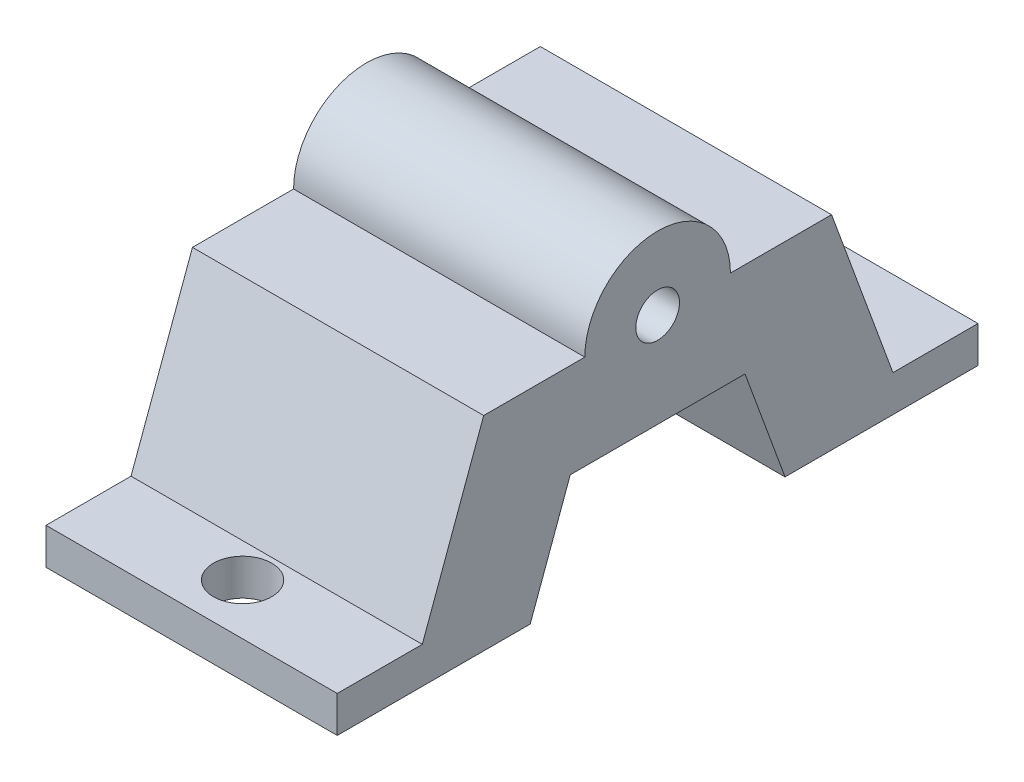
ISO-10303-21;
HEADER;
FILE_DESCRIPTION(('STEP AP214'),'2;1');
FILE_NAME('part.step','',(''),(''),'','','');
FILE_SCHEMA(('AUTOMOTIVE_DESIGN { 1 0 10303 214 1 1 1 1 }'));
ENDSEC;
DATA;
#1=APPLICATION_CONTEXT('core data for automotive mechanical design processes');
#2=APPLICATION_PROTOCOL_DEFINITION('international standard','automotive_design',2000,#1);
#3=PRODUCT_CONTEXT('',#1,'mechanical');
#4=PRODUCT('Part','Part','',(#3));
#5=PRODUCT_RELATED_PRODUCT_CATEGORY('part','',(#4));
#6=PRODUCT_DEFINITION_FORMATION('','',#4);
#7=PRODUCT_DEFINITION_CONTEXT('part definition',#1,'design');
#8=PRODUCT_DEFINITION('design','',#6,#7);
#9=PRODUCT_DEFINITION_SHAPE('','',#8);
#10=(LENGTH_UNIT() NAMED_UNIT(*) SI_UNIT(.MILLI.,.METRE.));
#11=(NAMED_UNIT(*) PLANE_ANGLE_UNIT() SI_UNIT($,.RADIAN.));
#12=(NAMED_UNIT(*) SI_UNIT($,.STERADIAN.) SOLID_ANGLE_UNIT());
#13=UNCERTAINTY_MEASURE_WITH_UNIT(LENGTH_MEASURE(1.E-05),#10,'distance_accuracy_value','');
#14=(GEOMETRIC_REPRESENTATION_CONTEXT(3) GLOBAL_UNCERTAINTY_ASSIGNED_CONTEXT((#13)) GLOBAL_UNIT_ASSIGNED_CONTEXT((#10,
#11,#12)) REPRESENTATION_CONTEXT('',''));
#15=CARTESIAN_POINT('',(0.,0.,0.));
#16=DIRECTION('',(0.,0.,1.));
#17=DIRECTION('',(1.,0.,0.));
#18=AXIS2_PLACEMENT_3D('',#15,#16,#17);
#19=CARTESIAN_POINT('',(-40.,0.,24.0972271209374));
#20=DIRECTION('',(0.,-1.,0.));
#21=DIRECTION('',(0.,0.,-1.));
#22=AXIS2_PLACEMENT_3D('',#19,#20,#21);
#23=PLANE('',#22);
#24=CARTESIAN_POINT('',(-20.,0.,17.0972271209374));
#25=DIRECTION('',(0.,-1.,0.));
#26=DIRECTION('',(0.,0.,-1.));
#27=AXIS2_PLACEMENT_3D('',#24,#25,#26);
#28=CIRCLE('',#27,4.);
#29=CARTESIAN_POINT('',(-20.,0.,13.0972271209374));
#30=VERTEX_POINT('',#29);
#31=EDGE_CURVE('E312',#30,#30,#28,.T.);
#32=ORIENTED_EDGE('',*,*,#31,.F.);
#33=EDGE_LOOP('',(#32));
#34=FACE_BOUND('',#33,.T.);
#35=DIRECTION('',(0.,0.,-1.));
#36=VECTOR('',#35,1.);
#37=CARTESIAN_POINT('',(0.,0.,24.0972271209374));
#38=LINE('',#37,#36);
#39=CARTESIAN_POINT('',(0.,0.,24.0972271209374));
#40=VERTEX_POINT('',#39);
#41=CARTESIAN_POINT('',(0.,0.,-2.40277287906259));
#42=VERTEX_POINT('',#41);
#43=EDGE_CURVE('E171',#40,#42,#38,.T.);
#44=ORIENTED_EDGE('',*,*,#43,.F.);
#45=DIRECTION('',(1.,0.,0.));
#46=VECTOR('',#45,1.);
#47=CARTESIAN_POINT('',(-40.,0.,24.0972271209374));
#48=LINE('',#47,#46);
#49=CARTESIAN_POINT('',(-40.,0.,24.0972271209374));
#50=VERTEX_POINT('',#49);
#51=EDGE_CURVE('E11',#50,#40,#48,.T.);
#52=ORIENTED_EDGE('',*,*,#51,.F.);
#53=DIRECTION('',(0.,0.,-1.));
#54=VECTOR('',#53,1.);
#55=CARTESIAN_POINT('',(-40.,0.,24.0972271209374));
#56=LINE('',#55,#54);
#57=CARTESIAN_POINT('',(-40.,0.,-2.40277287906259));
#58=VERTEX_POINT('',#57);
#59=EDGE_CURVE('E210',#50,#58,#56,.T.);
#60=ORIENTED_EDGE('',*,*,#59,.T.);
#61=DIRECTION('',(1.,0.,0.));
#62=VECTOR('',#61,1.);
#63=CARTESIAN_POINT('',(-40.,0.,-2.40277287906259));
#64=LINE('',#63,#62);
#65=EDGE_CURVE('E111',#58,#42,#64,.T.);
#66=ORIENTED_EDGE('',*,*,#65,.T.);
#67=EDGE_LOOP('',(#44,#52,#60,#66));
#68=FACE_BOUND('',#67,.T.);
#69=ADVANCED_FACE('F37',(#34,#68),#23,.T.);
#70=CARTESIAN_POINT('',(-40.,0.,24.0972271209374));
#71=DIRECTION('',(0.,0.,1.));
#72=DIRECTION('',(1.,0.,0.));
#73=AXIS2_PLACEMENT_3D('',#70,#71,#72);
#74=PLANE('',#73);
#75=DIRECTION('',(0.,-1.,0.));
#76=VECTOR('',#75,1.);
#77=CARTESIAN_POINT('',(0.,0.,24.0972271209374));
#78=LINE('',#77,#76);
#79=CARTESIAN_POINT('',(0.,5.,24.0972271209374));
#80=VERTEX_POINT('',#79);
#81=EDGE_CURVE('E208',#80,#40,#78,.T.);
#82=ORIENTED_EDGE('',*,*,#81,.F.);
#83=DIRECTION('',(1.,0.,0.));
#84=VECTOR('',#83,1.);
#85=CARTESIAN_POINT('',(-40.,5.,24.0972271209374));
#86=LINE('',#85,#84);
#87=CARTESIAN_POINT('',(-40.,5.,24.0972271209374));
#88=VERTEX_POINT('',#87);
#89=EDGE_CURVE('E46',#88,#80,#86,.T.);
#90=ORIENTED_EDGE('',*,*,#89,.F.);
#91=DIRECTION('',(0.,-1.,0.));
#92=VECTOR('',#91,1.);
#93=CARTESIAN_POINT('',(-40.,0.,24.0972271209374));
#94=LINE('',#93,#92);
#95=EDGE_CURVE('E161',#88,#50,#94,.T.);
#96=ORIENTED_EDGE('',*,*,#95,.T.);
#97=ORIENTED_EDGE('',*,*,#51,.T.);
#98=EDGE_LOOP('',(#82,#90,#96,#97));
#99=FACE_BOUND('',#98,.T.);
#100=ADVANCED_FACE('F235',(#99),#74,.T.);
#101=CARTESIAN_POINT('',(-40.,5.,24.0972271209374));
#102=DIRECTION('',(0.,1.,0.));
#103=DIRECTION('',(0.,0.,1.));
#104=AXIS2_PLACEMENT_3D('',#101,#102,#103);
#105=PLANE('',#104);
#106=CARTESIAN_POINT('',(-20.,5.,17.0972271209374));
#107=DIRECTION('',(0.,1.,0.));
#108=DIRECTION('',(0.,0.,1.));
#109=AXIS2_PLACEMENT_3D('',#106,#107,#108);
#110=CIRCLE('',#109,4.);
#111=CARTESIAN_POINT('',(-20.,5.,21.0972271209374));
#112=VERTEX_POINT('',#111);
#113=EDGE_CURVE('E315',#112,#112,#110,.T.);
#114=ORIENTED_EDGE('',*,*,#113,.F.);
#115=EDGE_LOOP('',(#114));
#116=FACE_BOUND('',#115,.T.);
#117=DIRECTION('',(0.,0.,1.));
#118=VECTOR('',#117,1.);
#119=CARTESIAN_POINT('',(0.,5.,24.0972271209374));
#120=LINE('',#119,#118);
#121=CARTESIAN_POINT('',(0.,5.,12.4183560056349));
#122=VERTEX_POINT('',#121);
#123=EDGE_CURVE('E148',#122,#80,#120,.T.);
#124=ORIENTED_EDGE('',*,*,#123,.F.);
#125=DIRECTION('',(1.,0.,0.));
#126=VECTOR('',#125,1.);
#127=CARTESIAN_POINT('',(-40.,5.,12.4183560056349));
#128=LINE('',#127,#126);
#129=CARTESIAN_POINT('',(-40.,5.,12.4183560056349));
#130=VERTEX_POINT('',#129);
#131=EDGE_CURVE('E143',#130,#122,#128,.T.);
#132=ORIENTED_EDGE('',*,*,#131,.F.);
#133=DIRECTION('',(0.,0.,1.));
#134=VECTOR('',#133,1.);
#135=CARTESIAN_POINT('',(-40.,5.,24.0972271209374));
#136=LINE('',#135,#134);
#137=EDGE_CURVE('E146',#130,#88,#136,.T.);
#138=ORIENTED_EDGE('',*,*,#137,.T.);
#139=ORIENTED_EDGE('',*,*,#89,.T.);
#140=EDGE_LOOP('',(#124,#132,#138,#139));
#141=FACE_BOUND('',#140,.T.);
#142=ADVANCED_FACE('F145',(#116,#141),#105,.T.);
#143=CARTESIAN_POINT('',(-40.,5.,12.4183560056349));
#144=DIRECTION('',(0.,0.344254649158423,0.938876315886609));
#145=DIRECTION('',(0.,-0.938876315886609,0.344254649158423));
#146=AXIS2_PLACEMENT_3D('',#143,#144,#145);
#147=PLANE('',#146);
#148=DIRECTION('',(0.,-0.938876315886609,0.344254649158423));
#149=VECTOR('',#148,1.);
#150=CARTESIAN_POINT('',(0.,5.,12.4183560056349));
#151=LINE('',#150,#149);
#152=CARTESIAN_POINT('',(0.,28.,3.98502267230156));
#153=VERTEX_POINT('',#152);
#154=EDGE_CURVE('E205',#153,#122,#151,.T.);
#155=ORIENTED_EDGE('',*,*,#154,.F.);
#156=DIRECTION('',(1.,0.,0.));
#157=VECTOR('',#156,1.);
#158=CARTESIAN_POINT('',(-40.,28.,3.98502267230156));
#159=LINE('',#158,#157);
#160=CARTESIAN_POINT('',(-40.,28.,3.98502267230156));
#161=VERTEX_POINT('',#160);
#162=EDGE_CURVE('E153',#161,#153,#159,.T.);
#163=ORIENTED_EDGE('',*,*,#162,.F.);
#164=DIRECTION('',(0.,-0.938876315886609,0.344254649158423));
#165=VECTOR('',#164,1.);
#166=CARTESIAN_POINT('',(-40.,5.,12.4183560056349));
#167=LINE('',#166,#165);
#168=EDGE_CURVE('E159',#161,#130,#167,.T.);
#169=ORIENTED_EDGE('',*,*,#168,.T.);
#170=ORIENTED_EDGE('',*,*,#131,.T.);
#171=EDGE_LOOP('',(#155,#163,#169,#170));
#172=FACE_BOUND('',#171,.T.);
#173=ADVANCED_FACE('F163',(#172),#147,.T.);
#174=CARTESIAN_POINT('',(-40.,28.,3.98502267230156));
#175=DIRECTION('',(0.,1.,0.));
#176=DIRECTION('',(0.,0.,1.));
#177=AXIS2_PLACEMENT_3D('',#174,#175,#176);
#178=PLANE('',#177);
#179=DIRECTION('',(0.,0.,1.));
#180=VECTOR('',#179,1.);
#181=CARTESIAN_POINT('',(0.,28.,3.98502267230156));
#182=LINE('',#181,#180);
#183=CARTESIAN_POINT('',(0.,28.,-9.9027728790626));
#184=VERTEX_POINT('',#183);
#185=EDGE_CURVE('E202',#184,#153,#182,.T.);
#186=ORIENTED_EDGE('',*,*,#185,.F.);
#187=DIRECTION('',(1.,0.,0.));
#188=VECTOR('',#187,1.);
#189=CARTESIAN_POINT('',(-40.,28.,-9.9027728790626));
#190=LINE('',#189,#188);
#191=CARTESIAN_POINT('',(-40.,28.,-9.9027728790626));
#192=VERTEX_POINT('',#191);
#193=EDGE_CURVE('E214',#192,#184,#190,.T.);
#194=ORIENTED_EDGE('',*,*,#193,.F.);
#195=DIRECTION('',(0.,0.,1.));
#196=VECTOR('',#195,1.);
#197=CARTESIAN_POINT('',(-40.,28.,3.98502267230156));
#198=LINE('',#197,#196);
#199=EDGE_CURVE('E164',#192,#161,#198,.T.);
#200=ORIENTED_EDGE('',*,*,#199,.T.);
#201=ORIENTED_EDGE('',*,*,#162,.T.);
#202=EDGE_LOOP('',(#186,#194,#200,#201));
#203=FACE_BOUND('',#202,.T.);
#204=ADVANCED_FACE('F250',(#203),#178,.T.);
#205=CARTESIAN_POINT('',(-40.,28.,-19.9027728790626));
#206=DIRECTION('',(1.,0.,0.));
#207=DIRECTION('',(0.,0.,-1.));
#208=AXIS2_PLACEMENT_3D('',#205,#206,#207);
#209=CYLINDRICAL_SURFACE('',#208,10.);
#210=CARTESIAN_POINT('',(0.,28.,-19.9027728790626));
#211=DIRECTION('',(1.,0.,0.));
#212=DIRECTION('',(0.,0.,1.));
#213=AXIS2_PLACEMENT_3D('',#210,#211,#212);
#214=CIRCLE('',#213,10.);
#215=CARTESIAN_POINT('',(0.,28.,-29.9027728790626));
#216=VERTEX_POINT('',#215);
#217=EDGE_CURVE('E199',#216,#184,#214,.T.);
#218=ORIENTED_EDGE('',*,*,#217,.F.);
#219=DIRECTION('',(1.,0.,0.));
#220=VECTOR('',#219,1.);
#221=CARTESIAN_POINT('',(-40.,28.,-29.9027728790626));
#222=LINE('',#221,#220);
#223=CARTESIAN_POINT('',(-40.,28.,-29.9027728790626));
#224=VERTEX_POINT('',#223);
#225=EDGE_CURVE('E216',#224,#216,#222,.T.);
#226=ORIENTED_EDGE('',*,*,#225,.F.);
#227=CARTESIAN_POINT('',(-40.,28.,-19.9027728790626));
#228=DIRECTION('',(1.,0.,0.));
#229=DIRECTION('',(0.,0.,1.));
#230=AXIS2_PLACEMENT_3D('',#227,#228,#229);
#231=CIRCLE('',#230,10.);
#232=EDGE_CURVE('E166',#224,#192,#231,.T.);
#233=ORIENTED_EDGE('',*,*,#232,.T.);
#234=ORIENTED_EDGE('',*,*,#193,.T.);
#235=EDGE_LOOP('',(#218,#226,#233,#234));
#236=FACE_BOUND('',#235,.T.);
#237=ADVANCED_FACE('F253',(#236),#209,.T.);
#238=CARTESIAN_POINT('',(-40.,28.,-43.7905684304268));
#239=DIRECTION('',(0.,1.,0.));
#240=DIRECTION('',(0.,0.,1.));
#241=AXIS2_PLACEMENT_3D('',#238,#239,#240);
#242=PLANE('',#241);
#243=DIRECTION('',(0.,0.,1.));
#244=VECTOR('',#243,1.);
#245=CARTESIAN_POINT('',(0.,28.,-43.7905684304268));
#246=LINE('',#245,#244);
#247=CARTESIAN_POINT('',(0.,28.,-43.7905684304268));
#248=VERTEX_POINT('',#247);
#249=EDGE_CURVE('E196',#248,#216,#246,.T.);
#250=ORIENTED_EDGE('',*,*,#249,.F.);
#251=DIRECTION('',(1.,0.,0.));
#252=VECTOR('',#251,1.);
#253=CARTESIAN_POINT('',(-40.,28.,-43.7905684304268));
#254=LINE('',#253,#252);
#255=CARTESIAN_POINT('',(-40.,28.,-43.7905684304268));
#256=VERTEX_POINT('',#255);
#257=EDGE_CURVE('E218',#256,#248,#254,.T.);
#258=ORIENTED_EDGE('',*,*,#257,.F.);
#259=DIRECTION('',(0.,0.,1.));
#260=VECTOR('',#259,1.);
#261=CARTESIAN_POINT('',(-40.,28.,-43.7905684304268));
#262=LINE('',#261,#260);
#263=EDGE_CURVE('E348',#256,#224,#262,.T.);
#264=ORIENTED_EDGE('',*,*,#263,.T.);
#265=ORIENTED_EDGE('',*,*,#225,.T.);
#266=EDGE_LOOP('',(#250,#258,#264,#265));
#267=FACE_BOUND('',#266,.T.);
#268=ADVANCED_FACE('F257',(#267),#242,.T.);
#269=CARTESIAN_POINT('',(-40.,5.,-52.2239017637601));
#270=DIRECTION('',(0.,0.344254649158423,-0.938876315886609));
#271=DIRECTION('',(0.,0.938876315886609,0.344254649158423));
#272=AXIS2_PLACEMENT_3D('',#269,#270,#271);
#273=PLANE('',#272);
#274=DIRECTION('',(0.,0.938876315886609,0.344254649158423));
#275=VECTOR('',#274,1.);
#276=CARTESIAN_POINT('',(0.,5.,-52.2239017637601));
#277=LINE('',#276,#275);
#278=CARTESIAN_POINT('',(0.,5.,-52.2239017637601));
#279=VERTEX_POINT('',#278);
#280=EDGE_CURVE('E193',#279,#248,#277,.T.);
#281=ORIENTED_EDGE('',*,*,#280,.F.);
#282=DIRECTION('',(1.,0.,0.));
#283=VECTOR('',#282,1.);
#284=CARTESIAN_POINT('',(-40.,5.,-52.2239017637601));
#285=LINE('',#284,#283);
#286=CARTESIAN_POINT('',(-40.,5.,-52.2239017637601));
#287=VERTEX_POINT('',#286);
#288=EDGE_CURVE('E220',#287,#279,#285,.T.);
#289=ORIENTED_EDGE('',*,*,#288,.F.);
#290=DIRECTION('',(0.,0.938876315886609,0.344254649158423));
#291=VECTOR('',#290,1.);
#292=CARTESIAN_POINT('',(-40.,5.,-52.2239017637601));
#293=LINE('',#292,#291);
#294=EDGE_CURVE('E345',#287,#256,#293,.T.);
#295=ORIENTED_EDGE('',*,*,#294,.T.);
#296=ORIENTED_EDGE('',*,*,#257,.T.);
#297=EDGE_LOOP('',(#281,#289,#295,#296));
#298=FACE_BOUND('',#297,.T.);
#299=ADVANCED_FACE('F261',(#298),#273,.T.);
#300=CARTESIAN_POINT('',(-40.,5.,-63.9027728790626));
#301=DIRECTION('',(0.,1.,0.));
#302=DIRECTION('',(0.,0.,1.));
#303=AXIS2_PLACEMENT_3D('',#300,#301,#302);
#304=PLANE('',#303);
#305=CARTESIAN_POINT('',(-20.,4.99999999999998,-56.9027728790626));
#306=DIRECTION('',(0.,1.,0.));
#307=DIRECTION('',(0.,0.,1.));
#308=AXIS2_PLACEMENT_3D('',#305,#306,#307);
#309=CIRCLE('',#308,4.);
#310=CARTESIAN_POINT('',(-20.,4.99999999999998,-52.9027728790626));
#311=VERTEX_POINT('',#310);
#312=EDGE_CURVE('E316',#311,#311,#309,.T.);
#313=ORIENTED_EDGE('',*,*,#312,.F.);
#314=EDGE_LOOP('',(#313));
#315=FACE_BOUND('',#314,.T.);
#316=DIRECTION('',(0.,0.,1.));
#317=VECTOR('',#316,1.);
#318=CARTESIAN_POINT('',(0.,5.,-63.9027728790626));
#319=LINE('',#318,#317);
#320=CARTESIAN_POINT('',(0.,5.,-63.9027728790626));
#321=VERTEX_POINT('',#320);
#322=EDGE_CURVE('E190',#321,#279,#319,.T.);
#323=ORIENTED_EDGE('',*,*,#322,.F.);
#324=DIRECTION('',(1.,0.,0.));
#325=VECTOR('',#324,1.);
#326=CARTESIAN_POINT('',(-40.,5.,-63.9027728790626));
#327=LINE('',#326,#325);
#328=CARTESIAN_POINT('',(-40.,5.,-63.9027728790626));
#329=VERTEX_POINT('',#328);
#330=EDGE_CURVE('E222',#329,#321,#327,.T.);
#331=ORIENTED_EDGE('',*,*,#330,.F.);
#332=DIRECTION('',(0.,0.,1.));
#333=VECTOR('',#332,1.);
#334=CARTESIAN_POINT('',(-40.,5.,-63.9027728790626));
#335=LINE('',#334,#333);
#336=EDGE_CURVE('E342',#329,#287,#335,.T.);
#337=ORIENTED_EDGE('',*,*,#336,.T.);
#338=ORIENTED_EDGE('',*,*,#288,.T.);
#339=EDGE_LOOP('',(#323,#331,#337,#338));
#340=FACE_BOUND('',#339,.T.);
#341=ADVANCED_FACE('F265',(#315,#340),#304,.T.);
#342=CARTESIAN_POINT('',(-40.,0.,-63.9027728790626));
#343=DIRECTION('',(0.,0.,-1.));
#344=DIRECTION('',(-1.,0.,0.));
#345=AXIS2_PLACEMENT_3D('',#342,#343,#344);
#346=PLANE('',#345);
#347=DIRECTION('',(0.,1.,0.));
#348=VECTOR('',#347,1.);
#349=CARTESIAN_POINT('',(0.,0.,-63.9027728790626));
#350=LINE('',#349,#348);
#351=CARTESIAN_POINT('',(0.,0.,-63.9027728790626));
#352=VERTEX_POINT('',#351);
#353=EDGE_CURVE('E187',#352,#321,#350,.T.);
#354=ORIENTED_EDGE('',*,*,#353,.F.);
#355=DIRECTION('',(1.,0.,0.));
#356=VECTOR('',#355,1.);
#357=CARTESIAN_POINT('',(-40.,0.,-63.9027728790626));
#358=LINE('',#357,#356);
#359=CARTESIAN_POINT('',(-40.,0.,-63.9027728790626));
#360=VERTEX_POINT('',#359);
#361=EDGE_CURVE('E224',#360,#352,#358,.T.);
#362=ORIENTED_EDGE('',*,*,#361,.F.);
#363=DIRECTION('',(0.,1.,0.));
#364=VECTOR('',#363,1.);
#365=CARTESIAN_POINT('',(-40.,0.,-63.9027728790626));
#366=LINE('',#365,#364);
#367=EDGE_CURVE('E339',#360,#329,#366,.T.);
#368=ORIENTED_EDGE('',*,*,#367,.T.);
#369=ORIENTED_EDGE('',*,*,#330,.T.);
#370=EDGE_LOOP('',(#354,#362,#368,#369));
#371=FACE_BOUND('',#370,.T.);
#372=ADVANCED_FACE('F269',(#371),#346,.T.);
#373=CARTESIAN_POINT('',(-40.,0.,-37.4027728790626));
#374=DIRECTION('',(0.,-1.,0.));
#375=DIRECTION('',(0.,0.,-1.));
#376=AXIS2_PLACEMENT_3D('',#373,#374,#375);
#377=PLANE('',#376);
#378=CARTESIAN_POINT('',(-20.,0.,-56.9027728790626));
#379=DIRECTION('',(0.,-1.,0.));
#380=DIRECTION('',(0.,0.,-1.));
#381=AXIS2_PLACEMENT_3D('',#378,#379,#380);
#382=CIRCLE('',#381,4.);
#383=CARTESIAN_POINT('',(-20.,0.,-60.9027728790626));
#384=VERTEX_POINT('',#383);
#385=EDGE_CURVE('E40',#384,#384,#382,.T.);
#386=ORIENTED_EDGE('',*,*,#385,.F.);
#387=EDGE_LOOP('',(#386));
#388=FACE_BOUND('',#387,.T.);
#389=DIRECTION('',(0.,0.,-1.));
#390=VECTOR('',#389,1.);
#391=CARTESIAN_POINT('',(0.,0.,-37.4027728790626));
#392=LINE('',#391,#390);
#393=CARTESIAN_POINT('',(0.,0.,-37.4027728790626));
#394=VERTEX_POINT('',#393);
#395=EDGE_CURVE('E184',#394,#352,#392,.T.);
#396=ORIENTED_EDGE('',*,*,#395,.F.);
#397=DIRECTION('',(1.,0.,0.));
#398=VECTOR('',#397,1.);
#399=CARTESIAN_POINT('',(-40.,0.,-37.4027728790626));
#400=LINE('',#399,#398);
#401=CARTESIAN_POINT('',(-40.,0.,-37.4027728790626));
#402=VERTEX_POINT('',#401);
#403=EDGE_CURVE('E226',#402,#394,#400,.T.);
#404=ORIENTED_EDGE('',*,*,#403,.F.);
#405=DIRECTION('',(0.,0.,-1.));
#406=VECTOR('',#405,1.);
#407=CARTESIAN_POINT('',(-40.,0.,-37.4027728790626));
#408=LINE('',#407,#406);
#409=EDGE_CURVE('E336',#402,#360,#408,.T.);
#410=ORIENTED_EDGE('',*,*,#409,.T.);
#411=ORIENTED_EDGE('',*,*,#361,.T.);
#412=EDGE_LOOP('',(#396,#404,#410,#411));
#413=FACE_BOUND('',#412,.T.);
#414=ADVANCED_FACE('F273',(#388,#413),#377,.T.);
#415=CARTESIAN_POINT('',(-40.,15.,-31.9027728790626));
#416=DIRECTION('',(0.,-0.344254649158423,0.938876315886609));
#417=DIRECTION('',(0.,-0.938876315886609,-0.344254649158423));
#418=AXIS2_PLACEMENT_3D('',#415,#416,#417);
#419=PLANE('',#418);
#420=DIRECTION('',(0.,-0.938876315886609,-0.344254649158423));
#421=VECTOR('',#420,1.);
#422=CARTESIAN_POINT('',(0.,15.,-31.9027728790626));
#423=LINE('',#422,#421);
#424=CARTESIAN_POINT('',(0.,15.,-31.9027728790626));
#425=VERTEX_POINT('',#424);
#426=EDGE_CURVE('E181',#425,#394,#423,.T.);
#427=ORIENTED_EDGE('',*,*,#426,.F.);
#428=DIRECTION('',(1.,0.,0.));
#429=VECTOR('',#428,1.);
#430=CARTESIAN_POINT('',(-40.,15.,-31.9027728790626));
#431=LINE('',#430,#429);
#432=CARTESIAN_POINT('',(-40.,15.,-31.9027728790626));
#433=VERTEX_POINT('',#432);
#434=EDGE_CURVE('E228',#433,#425,#431,.T.);
#435=ORIENTED_EDGE('',*,*,#434,.F.);
#436=DIRECTION('',(0.,-0.938876315886609,-0.344254649158423));
#437=VECTOR('',#436,1.);
#438=CARTESIAN_POINT('',(-40.,15.,-31.9027728790626));
#439=LINE('',#438,#437);
#440=EDGE_CURVE('E333',#433,#402,#439,.T.);
#441=ORIENTED_EDGE('',*,*,#440,.T.);
#442=ORIENTED_EDGE('',*,*,#403,.T.);
#443=EDGE_LOOP('',(#427,#435,#441,#442));
#444=FACE_BOUND('',#443,.T.);
#445=ADVANCED_FACE('F277',(#444),#419,.T.);
#446=CARTESIAN_POINT('',(-40.,15.,-7.9027728790626));
#447=DIRECTION('',(0.,-1.,0.));
#448=DIRECTION('',(0.,0.,-1.));
#449=AXIS2_PLACEMENT_3D('',#446,#447,#448);
#450=PLANE('',#449);
#451=DIRECTION('',(0.,0.,-1.));
#452=VECTOR('',#451,1.);
#453=CARTESIAN_POINT('',(0.,15.,-7.9027728790626));
#454=LINE('',#453,#452);
#455=CARTESIAN_POINT('',(0.,15.,-7.9027728790626));
#456=VERTEX_POINT('',#455);
#457=EDGE_CURVE('E178',#456,#425,#454,.T.);
#458=ORIENTED_EDGE('',*,*,#457,.F.);
#459=DIRECTION('',(1.,0.,0.));
#460=VECTOR('',#459,1.);
#461=CARTESIAN_POINT('',(-40.,15.,-7.9027728790626));
#462=LINE('',#461,#460);
#463=CARTESIAN_POINT('',(-40.,15.,-7.9027728790626));
#464=VERTEX_POINT('',#463);
#465=EDGE_CURVE('E230',#464,#456,#462,.T.);
#466=ORIENTED_EDGE('',*,*,#465,.F.);
#467=DIRECTION('',(0.,0.,-1.));
#468=VECTOR('',#467,1.);
#469=CARTESIAN_POINT('',(-40.,15.,-7.9027728790626));
#470=LINE('',#469,#468);
#471=EDGE_CURVE('E330',#464,#433,#470,.T.);
#472=ORIENTED_EDGE('',*,*,#471,.T.);
#473=ORIENTED_EDGE('',*,*,#434,.T.);
#474=EDGE_LOOP('',(#458,#466,#472,#473));
#475=FACE_BOUND('',#474,.T.);
#476=ADVANCED_FACE('F281',(#475),#450,.T.);
#477=CARTESIAN_POINT('',(-40.,0.,-2.40277287906259));
#478=DIRECTION('',(0.,-0.344254649158424,-0.938876315886608));
#479=DIRECTION('',(0.,0.938876315886609,-0.344254649158424));
#480=AXIS2_PLACEMENT_3D('',#477,#478,#479);
#481=PLANE('',#480);
#482=DIRECTION('',(0.,0.938876315886608,-0.344254649158424));
#483=VECTOR('',#482,1.);
#484=CARTESIAN_POINT('',(0.,0.,-2.40277287906259));
#485=LINE('',#484,#483);
#486=EDGE_CURVE('E174',#42,#456,#485,.T.);
#487=ORIENTED_EDGE('',*,*,#486,.F.);
#488=ORIENTED_EDGE('',*,*,#65,.F.);
#489=DIRECTION('',(0.,0.938876315886608,-0.344254649158424));
#490=VECTOR('',#489,1.);
#491=CARTESIAN_POINT('',(-40.,0.,-2.40277287906259));
#492=LINE('',#491,#490);
#493=EDGE_CURVE('E328',#58,#464,#492,.T.);
#494=ORIENTED_EDGE('',*,*,#493,.T.);
#495=ORIENTED_EDGE('',*,*,#465,.T.);
#496=EDGE_LOOP('',(#487,#488,#494,#495));
#497=FACE_BOUND('',#496,.T.);
#498=ADVANCED_FACE('F231',(#497),#481,.T.);
#499=CARTESIAN_POINT('',(-40.,28.,-19.9027728790626));
#500=DIRECTION('',(-1.,0.,0.));
#501=DIRECTION('',(0.,0.,1.));
#502=AXIS2_PLACEMENT_3D('',#499,#500,#501);
#503=PLANE('',#502);
#504=CARTESIAN_POINT('',(-40.,28.,-19.9027728790626));
#505=DIRECTION('',(1.,0.,0.));
#506=DIRECTION('',(0.,0.,-1.));
#507=AXIS2_PLACEMENT_3D('',#504,#505,#506);
#508=CIRCLE('',#507,3.);
#509=CARTESIAN_POINT('',(-40.,28.,-22.9027728790626));
#510=VERTEX_POINT('',#509);
#511=EDGE_CURVE('E175',#510,#510,#508,.T.);
#512=ORIENTED_EDGE('',*,*,#511,.T.);
#513=EDGE_LOOP('',(#512));
#514=FACE_BOUND('',#513,.T.);
#515=ORIENTED_EDGE('',*,*,#59,.F.);
#516=ORIENTED_EDGE('',*,*,#95,.F.);
#517=ORIENTED_EDGE('',*,*,#137,.F.);
#518=ORIENTED_EDGE('',*,*,#168,.F.);
#519=ORIENTED_EDGE('',*,*,#199,.F.);
#520=ORIENTED_EDGE('',*,*,#232,.F.);
#521=ORIENTED_EDGE('',*,*,#263,.F.);
#522=ORIENTED_EDGE('',*,*,#294,.F.);
#523=ORIENTED_EDGE('',*,*,#336,.F.);
#524=ORIENTED_EDGE('',*,*,#367,.F.);
#525=ORIENTED_EDGE('',*,*,#409,.F.);
#526=ORIENTED_EDGE('',*,*,#440,.F.);
#527=ORIENTED_EDGE('',*,*,#471,.F.);
#528=ORIENTED_EDGE('',*,*,#493,.F.);
#529=EDGE_LOOP('',(#515,#516,#517,#518,#519,#520,#521,#522,#523,#524,#525,#526,#527,#528));
#530=FACE_BOUND('',#529,.T.);
#531=ADVANCED_FACE('F157',(#514,#530),#503,.T.);
#532=CARTESIAN_POINT('',(0.,28.,-19.9027728790626));
#533=DIRECTION('',(-1.,0.,0.));
#534=DIRECTION('',(0.,0.,1.));
#535=AXIS2_PLACEMENT_3D('',#532,#533,#534);
#536=PLANE('',#535);
#537=CARTESIAN_POINT('',(0.,28.,-19.9027728790626));
#538=DIRECTION('',(1.,0.,0.));
#539=DIRECTION('',(0.,0.,-1.));
#540=AXIS2_PLACEMENT_3D('',#537,#538,#539);
#541=CIRCLE('',#540,3.);
#542=CARTESIAN_POINT('',(0.,28.,-22.9027728790626));
#543=VERTEX_POINT('',#542);
#544=EDGE_CURVE('E323',#543,#543,#541,.T.);
#545=ORIENTED_EDGE('',*,*,#544,.F.);
#546=EDGE_LOOP('',(#545));
#547=FACE_BOUND('',#546,.T.);
#548=ORIENTED_EDGE('',*,*,#43,.T.);
#549=ORIENTED_EDGE('',*,*,#486,.T.);
#550=ORIENTED_EDGE('',*,*,#457,.T.);
#551=ORIENTED_EDGE('',*,*,#426,.T.);
#552=ORIENTED_EDGE('',*,*,#395,.T.);
#553=ORIENTED_EDGE('',*,*,#353,.T.);
#554=ORIENTED_EDGE('',*,*,#322,.T.);
#555=ORIENTED_EDGE('',*,*,#280,.T.);
#556=ORIENTED_EDGE('',*,*,#249,.T.);
#557=ORIENTED_EDGE('',*,*,#217,.T.);
#558=ORIENTED_EDGE('',*,*,#185,.T.);
#559=ORIENTED_EDGE('',*,*,#154,.T.);
#560=ORIENTED_EDGE('',*,*,#123,.T.);
#561=ORIENTED_EDGE('',*,*,#81,.T.);
#562=EDGE_LOOP('',(#548,#549,#550,#551,#552,#553,#554,#555,#556,#557,#558,#559,#560,#561));
#563=FACE_BOUND('',#562,.T.);
#564=ADVANCED_FACE('F234',(#547,#563),#536,.F.);
#565=CARTESIAN_POINT('',(-40.,28.,-19.9027728790626));
#566=DIRECTION('',(1.,0.,0.));
#567=DIRECTION('',(0.,0.,-1.));
#568=AXIS2_PLACEMENT_3D('',#565,#566,#567);
#569=CYLINDRICAL_SURFACE('',#568,3.);
#570=ORIENTED_EDGE('',*,*,#511,.F.);
#571=EDGE_LOOP('',(#570));
#572=FACE_BOUND('',#571,.T.);
#573=ORIENTED_EDGE('',*,*,#544,.T.);
#574=EDGE_LOOP('',(#573));
#575=FACE_BOUND('',#574,.T.);
#576=ADVANCED_FACE('F293',(#572,#575),#569,.F.);
#577=CARTESIAN_POINT('',(-20.,-35.,-56.9027728790626));
#578=DIRECTION('',(0.,1.,0.));
#579=DIRECTION('',(0.,0.,1.));
#580=AXIS2_PLACEMENT_3D('',#577,#578,#579);
#581=CYLINDRICAL_SURFACE('',#580,4.);
#582=ORIENTED_EDGE('',*,*,#385,.T.);
#583=EDGE_LOOP('',(#582));
#584=FACE_BOUND('',#583,.T.);
#585=ORIENTED_EDGE('',*,*,#312,.T.);
#586=EDGE_LOOP('',(#585));
#587=FACE_BOUND('',#586,.T.);
#588=ADVANCED_FACE('F299',(#584,#587),#581,.F.);
#589=CARTESIAN_POINT('',(-20.,-35.,17.0972271209374));
#590=DIRECTION('',(0.,1.,0.));
#591=DIRECTION('',(0.,0.,1.));
#592=AXIS2_PLACEMENT_3D('',#589,#590,#591);
#593=CYLINDRICAL_SURFACE('',#592,4.);
#594=ORIENTED_EDGE('',*,*,#31,.T.);
#595=EDGE_LOOP('',(#594));
#596=FACE_BOUND('',#595,.T.);
#597=ORIENTED_EDGE('',*,*,#113,.T.);
#598=EDGE_LOOP('',(#597));
#599=FACE_BOUND('',#598,.T.);
#600=ADVANCED_FACE('F303',(#596,#599),#593,.F.);
#601=CLOSED_SHELL('',(#69,#100,#142,#173,#204,#237,#268,#299,#341,#372,#414,#445,#476,#498,#531,
#564,#576,#588,#600));
#602=MANIFOLD_SOLID_BREP('B2',#601);
#603=ADVANCED_BREP_SHAPE_REPRESENTATION('',(#18,#602),#14);
#604=SHAPE_DEFINITION_REPRESENTATION(#9,#603);
ENDSEC;
END-ISO-10303-21;
